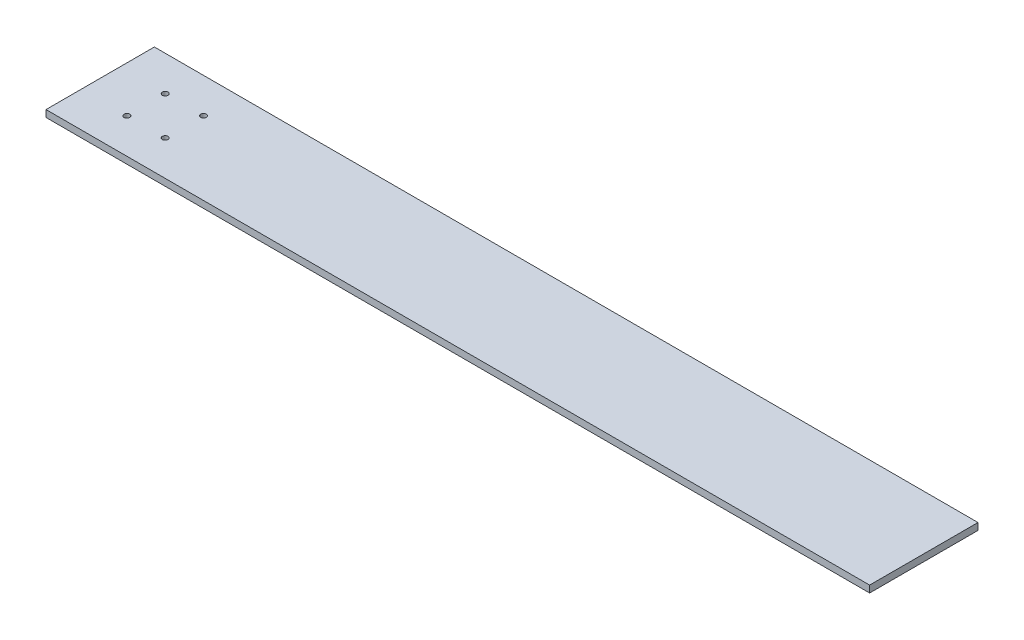
ISO-10303-21;
HEADER;
FILE_DESCRIPTION(('STEP AP214'),'2;1');
FILE_NAME('part.step','',(''),(''),'','','');
FILE_SCHEMA(('AUTOMOTIVE_DESIGN { 1 0 10303 214 1 1 1 1 }'));
ENDSEC;
DATA;
#1=APPLICATION_CONTEXT('core data for automotive mechanical design processes');
#2=APPLICATION_PROTOCOL_DEFINITION('international standard','automotive_design',2000,#1);
#3=PRODUCT_CONTEXT('',#1,'mechanical');
#4=PRODUCT('Part','Part','',(#3));
#5=PRODUCT_RELATED_PRODUCT_CATEGORY('part','',(#4));
#6=PRODUCT_DEFINITION_FORMATION('','',#4);
#7=PRODUCT_DEFINITION_CONTEXT('part definition',#1,'design');
#8=PRODUCT_DEFINITION('design','',#6,#7);
#9=PRODUCT_DEFINITION_SHAPE('','',#8);
#10=(LENGTH_UNIT() NAMED_UNIT(*) SI_UNIT(.MILLI.,.METRE.));
#11=(NAMED_UNIT(*) PLANE_ANGLE_UNIT() SI_UNIT($,.RADIAN.));
#12=(NAMED_UNIT(*) SI_UNIT($,.STERADIAN.) SOLID_ANGLE_UNIT());
#13=UNCERTAINTY_MEASURE_WITH_UNIT(LENGTH_MEASURE(1.E-05),#10,'distance_accuracy_value','');
#14=(GEOMETRIC_REPRESENTATION_CONTEXT(3) GLOBAL_UNCERTAINTY_ASSIGNED_CONTEXT((#13)) GLOBAL_UNIT_ASSIGNED_CONTEXT((#10,
#11,#12)) REPRESENTATION_CONTEXT('',''));
#15=CARTESIAN_POINT('',(0.,0.,0.));
#16=DIRECTION('',(0.,0.,1.));
#17=DIRECTION('',(1.,0.,0.));
#18=AXIS2_PLACEMENT_3D('',#15,#16,#17);
#19=CARTESIAN_POINT('',(0.,6.35,0.));
#20=DIRECTION('',(1.,0.,0.));
#21=DIRECTION('',(0.,0.,-1.));
#22=AXIS2_PLACEMENT_3D('',#19,#20,#21);
#23=PLANE('',#22);
#24=DIRECTION('',(0.,0.,1.));
#25=VECTOR('',#24,1.);
#26=CARTESIAN_POINT('',(0.,0.,0.));
#27=LINE('',#26,#25);
#28=CARTESIAN_POINT('',(0.,0.,-100.));
#29=VERTEX_POINT('',#28);
#30=CARTESIAN_POINT('',(0.,0.,0.));
#31=VERTEX_POINT('',#30);
#32=EDGE_CURVE('E122',#29,#31,#27,.T.);
#33=ORIENTED_EDGE('',*,*,#32,.T.);
#34=DIRECTION('',(0.,-1.,0.));
#35=VECTOR('',#34,1.);
#36=CARTESIAN_POINT('',(0.,6.35,0.));
#37=LINE('',#36,#35);
#38=CARTESIAN_POINT('',(0.,6.35,0.));
#39=VERTEX_POINT('',#38);
#40=EDGE_CURVE('E12',#39,#31,#37,.T.);
#41=ORIENTED_EDGE('',*,*,#40,.F.);
#42=DIRECTION('',(0.,0.,1.));
#43=VECTOR('',#42,1.);
#44=CARTESIAN_POINT('',(0.,6.35,0.));
#45=LINE('',#44,#43);
#46=CARTESIAN_POINT('',(0.,6.35,-100.));
#47=VERTEX_POINT('',#46);
#48=EDGE_CURVE('E89',#47,#39,#45,.T.);
#49=ORIENTED_EDGE('',*,*,#48,.F.);
#50=DIRECTION('',(0.,-1.,0.));
#51=VECTOR('',#50,1.);
#52=CARTESIAN_POINT('',(0.,6.35,-100.));
#53=LINE('',#52,#51);
#54=EDGE_CURVE('E100',#47,#29,#53,.T.);
#55=ORIENTED_EDGE('',*,*,#54,.T.);
#56=EDGE_LOOP('',(#33,#41,#49,#55));
#57=FACE_BOUND('',#56,.T.);
#58=ADVANCED_FACE('F38',(#57),#23,.F.);
#59=CARTESIAN_POINT('',(0.,6.35,0.));
#60=DIRECTION('',(0.,0.,-1.));
#61=DIRECTION('',(-1.,0.,0.));
#62=AXIS2_PLACEMENT_3D('',#59,#60,#61);
#63=PLANE('',#62);
#64=DIRECTION('',(1.,0.,0.));
#65=VECTOR('',#64,1.);
#66=CARTESIAN_POINT('',(0.,0.,0.));
#67=LINE('',#66,#65);
#68=CARTESIAN_POINT('',(760.,0.,0.));
#69=VERTEX_POINT('',#68);
#70=EDGE_CURVE('E94',#31,#69,#67,.T.);
#71=ORIENTED_EDGE('',*,*,#70,.T.);
#72=DIRECTION('',(0.,-1.,0.));
#73=VECTOR('',#72,1.);
#74=CARTESIAN_POINT('',(760.,6.35,0.));
#75=LINE('',#74,#73);
#76=CARTESIAN_POINT('',(760.,6.35,0.));
#77=VERTEX_POINT('',#76);
#78=EDGE_CURVE('E46',#77,#69,#75,.T.);
#79=ORIENTED_EDGE('',*,*,#78,.F.);
#80=DIRECTION('',(1.,0.,0.));
#81=VECTOR('',#80,1.);
#82=CARTESIAN_POINT('',(0.,6.35,0.));
#83=LINE('',#82,#81);
#84=EDGE_CURVE('E84',#39,#77,#83,.T.);
#85=ORIENTED_EDGE('',*,*,#84,.F.);
#86=ORIENTED_EDGE('',*,*,#40,.T.);
#87=EDGE_LOOP('',(#71,#79,#85,#86));
#88=FACE_BOUND('',#87,.T.);
#89=ADVANCED_FACE('F93',(#88),#63,.F.);
#90=CARTESIAN_POINT('',(760.,6.35,0.));
#91=DIRECTION('',(-1.,0.,0.));
#92=DIRECTION('',(0.,0.,1.));
#93=AXIS2_PLACEMENT_3D('',#90,#91,#92);
#94=PLANE('',#93);
#95=DIRECTION('',(0.,0.,-1.));
#96=VECTOR('',#95,1.);
#97=CARTESIAN_POINT('',(760.,0.,0.));
#98=LINE('',#97,#96);
#99=CARTESIAN_POINT('',(760.,0.,-100.));
#100=VERTEX_POINT('',#99);
#101=EDGE_CURVE('E71',#69,#100,#98,.T.);
#102=ORIENTED_EDGE('',*,*,#101,.T.);
#103=DIRECTION('',(0.,-1.,0.));
#104=VECTOR('',#103,1.);
#105=CARTESIAN_POINT('',(760.,6.35,-100.));
#106=LINE('',#105,#104);
#107=CARTESIAN_POINT('',(760.,6.35,-100.));
#108=VERTEX_POINT('',#107);
#109=EDGE_CURVE('E95',#108,#100,#106,.T.);
#110=ORIENTED_EDGE('',*,*,#109,.F.);
#111=DIRECTION('',(0.,0.,-1.));
#112=VECTOR('',#111,1.);
#113=CARTESIAN_POINT('',(760.,6.35,0.));
#114=LINE('',#113,#112);
#115=EDGE_CURVE('E87',#77,#108,#114,.T.);
#116=ORIENTED_EDGE('',*,*,#115,.F.);
#117=ORIENTED_EDGE('',*,*,#78,.T.);
#118=EDGE_LOOP('',(#102,#110,#116,#117));
#119=FACE_BOUND('',#118,.T.);
#120=ADVANCED_FACE('F96',(#119),#94,.F.);
#121=CARTESIAN_POINT('',(0.,6.35,-100.));
#122=DIRECTION('',(0.,0.,1.));
#123=DIRECTION('',(1.,0.,0.));
#124=AXIS2_PLACEMENT_3D('',#121,#122,#123);
#125=PLANE('',#124);
#126=DIRECTION('',(-1.,0.,0.));
#127=VECTOR('',#126,1.);
#128=CARTESIAN_POINT('',(0.,0.,-100.));
#129=LINE('',#128,#127);
#130=EDGE_CURVE('E77',#100,#29,#129,.T.);
#131=ORIENTED_EDGE('',*,*,#130,.T.);
#132=ORIENTED_EDGE('',*,*,#54,.F.);
#133=DIRECTION('',(-1.,0.,0.));
#134=VECTOR('',#133,1.);
#135=CARTESIAN_POINT('',(0.,6.35,-100.));
#136=LINE('',#135,#134);
#137=EDGE_CURVE('E54',#108,#47,#136,.T.);
#138=ORIENTED_EDGE('',*,*,#137,.F.);
#139=ORIENTED_EDGE('',*,*,#109,.T.);
#140=EDGE_LOOP('',(#131,#132,#138,#139));
#141=FACE_BOUND('',#140,.T.);
#142=ADVANCED_FACE('F161',(#141),#125,.F.);
#143=CARTESIAN_POINT('',(0.,6.35,0.));
#144=DIRECTION('',(0.,-1.,0.));
#145=DIRECTION('',(0.,0.,-1.));
#146=AXIS2_PLACEMENT_3D('',#143,#144,#145);
#147=PLANE('',#146);
#148=CARTESIAN_POINT('',(42.3225000000002,6.35,-32.3224999999998));
#149=DIRECTION('',(0.,1.,0.));
#150=DIRECTION('',(0.,0.,1.));
#151=AXIS2_PLACEMENT_3D('',#148,#149,#150);
#152=CIRCLE('',#151,2.625);
#153=CARTESIAN_POINT('',(42.3225000000002,6.35,-29.6974999999998));
#154=VERTEX_POINT('',#153);
#155=EDGE_CURVE('E123',#154,#154,#152,.T.);
#156=ORIENTED_EDGE('',*,*,#155,.F.);
#157=EDGE_LOOP('',(#156));
#158=FACE_BOUND('',#157,.T.);
#159=CARTESIAN_POINT('',(77.6775000000002,6.35,-32.3225000000002));
#160=DIRECTION('',(0.,1.,0.));
#161=DIRECTION('',(0.,0.,1.));
#162=AXIS2_PLACEMENT_3D('',#159,#160,#161);
#163=CIRCLE('',#162,2.625);
#164=CARTESIAN_POINT('',(77.6775000000002,6.35,-29.6975000000002));
#165=VERTEX_POINT('',#164);
#166=EDGE_CURVE('E133',#165,#165,#163,.T.);
#167=ORIENTED_EDGE('',*,*,#166,.F.);
#168=EDGE_LOOP('',(#167));
#169=FACE_BOUND('',#168,.T.);
#170=CARTESIAN_POINT('',(77.6774999999998,6.35,-67.6775000000003));
#171=DIRECTION('',(0.,1.,0.));
#172=DIRECTION('',(0.,0.,1.));
#173=AXIS2_PLACEMENT_3D('',#170,#171,#172);
#174=CIRCLE('',#173,2.625);
#175=CARTESIAN_POINT('',(77.6774999999998,6.35,-65.0525000000003));
#176=VERTEX_POINT('',#175);
#177=EDGE_CURVE('E140',#176,#176,#174,.T.);
#178=ORIENTED_EDGE('',*,*,#177,.F.);
#179=EDGE_LOOP('',(#178));
#180=FACE_BOUND('',#179,.T.);
#181=CARTESIAN_POINT('',(42.3224999999998,6.35,-67.6774999999998));
#182=DIRECTION('',(0.,1.,0.));
#183=DIRECTION('',(0.,0.,1.));
#184=AXIS2_PLACEMENT_3D('',#181,#182,#183);
#185=CIRCLE('',#184,2.625);
#186=CARTESIAN_POINT('',(42.3224999999998,6.35,-65.0524999999998));
#187=VERTEX_POINT('',#186);
#188=EDGE_CURVE('E113',#187,#187,#185,.T.);
#189=ORIENTED_EDGE('',*,*,#188,.F.);
#190=EDGE_LOOP('',(#189));
#191=FACE_BOUND('',#190,.T.);
#192=ORIENTED_EDGE('',*,*,#48,.T.);
#193=ORIENTED_EDGE('',*,*,#84,.T.);
#194=ORIENTED_EDGE('',*,*,#115,.T.);
#195=ORIENTED_EDGE('',*,*,#137,.T.);
#196=EDGE_LOOP('',(#192,#193,#194,#195));
#197=FACE_BOUND('',#196,.T.);
#198=ADVANCED_FACE('F85',(#158,#169,#180,#191,#197),#147,.F.);
#199=CARTESIAN_POINT('',(0.,0.,0.));
#200=DIRECTION('',(0.,-1.,0.));
#201=DIRECTION('',(0.,0.,-1.));
#202=AXIS2_PLACEMENT_3D('',#199,#200,#201);
#203=PLANE('',#202);
#204=CARTESIAN_POINT('',(42.3225000000002,0.,-32.3224999999998));
#205=DIRECTION('',(0.,1.,0.));
#206=DIRECTION('',(0.,0.,1.));
#207=AXIS2_PLACEMENT_3D('',#204,#205,#206);
#208=CIRCLE('',#207,2.625);
#209=CARTESIAN_POINT('',(42.3225000000002,0.,-29.6974999999998));
#210=VERTEX_POINT('',#209);
#211=EDGE_CURVE('E128',#210,#210,#208,.T.);
#212=ORIENTED_EDGE('',*,*,#211,.T.);
#213=EDGE_LOOP('',(#212));
#214=FACE_BOUND('',#213,.T.);
#215=CARTESIAN_POINT('',(77.6775000000002,0.,-32.3225000000002));
#216=DIRECTION('',(0.,1.,0.));
#217=DIRECTION('',(0.,0.,1.));
#218=AXIS2_PLACEMENT_3D('',#215,#216,#217);
#219=CIRCLE('',#218,2.625);
#220=CARTESIAN_POINT('',(77.6775000000002,0.,-29.6975000000002));
#221=VERTEX_POINT('',#220);
#222=EDGE_CURVE('E138',#221,#221,#219,.T.);
#223=ORIENTED_EDGE('',*,*,#222,.T.);
#224=EDGE_LOOP('',(#223));
#225=FACE_BOUND('',#224,.T.);
#226=CARTESIAN_POINT('',(77.6774999999998,0.,-67.6775000000003));
#227=DIRECTION('',(0.,1.,0.));
#228=DIRECTION('',(0.,0.,1.));
#229=AXIS2_PLACEMENT_3D('',#226,#227,#228);
#230=CIRCLE('',#229,2.625);
#231=CARTESIAN_POINT('',(77.6774999999998,0.,-65.0525000000003));
#232=VERTEX_POINT('',#231);
#233=EDGE_CURVE('E119',#232,#232,#230,.T.);
#234=ORIENTED_EDGE('',*,*,#233,.T.);
#235=EDGE_LOOP('',(#234));
#236=FACE_BOUND('',#235,.T.);
#237=CARTESIAN_POINT('',(42.3224999999998,0.,-67.6774999999998));
#238=DIRECTION('',(0.,1.,0.));
#239=DIRECTION('',(0.,0.,1.));
#240=AXIS2_PLACEMENT_3D('',#237,#238,#239);
#241=CIRCLE('',#240,2.625);
#242=CARTESIAN_POINT('',(42.3224999999998,0.,-65.0524999999998));
#243=VERTEX_POINT('',#242);
#244=EDGE_CURVE('E118',#243,#243,#241,.T.);
#245=ORIENTED_EDGE('',*,*,#244,.T.);
#246=EDGE_LOOP('',(#245));
#247=FACE_BOUND('',#246,.T.);
#248=ORIENTED_EDGE('',*,*,#32,.F.);
#249=ORIENTED_EDGE('',*,*,#130,.F.);
#250=ORIENTED_EDGE('',*,*,#101,.F.);
#251=ORIENTED_EDGE('',*,*,#70,.F.);
#252=EDGE_LOOP('',(#248,#249,#250,#251));
#253=FACE_BOUND('',#252,.T.);
#254=ADVANCED_FACE('F148',(#214,#225,#236,#247,#253),#203,.T.);
#255=CARTESIAN_POINT('',(42.3224999999998,0.,-67.6774999999998));
#256=DIRECTION('',(0.,1.,0.));
#257=DIRECTION('',(0.,0.,1.));
#258=AXIS2_PLACEMENT_3D('',#255,#256,#257);
#259=CYLINDRICAL_SURFACE('',#258,2.625);
#260=ORIENTED_EDGE('',*,*,#244,.F.);
#261=EDGE_LOOP('',(#260));
#262=FACE_BOUND('',#261,.T.);
#263=ORIENTED_EDGE('',*,*,#188,.T.);
#264=EDGE_LOOP('',(#263));
#265=FACE_BOUND('',#264,.T.);
#266=ADVANCED_FACE('F155',(#262,#265),#259,.F.);
#267=CARTESIAN_POINT('',(77.6774999999998,0.,-67.6775000000003));
#268=DIRECTION('',(0.,1.,0.));
#269=DIRECTION('',(0.,0.,1.));
#270=AXIS2_PLACEMENT_3D('',#267,#268,#269);
#271=CYLINDRICAL_SURFACE('',#270,2.625);
#272=ORIENTED_EDGE('',*,*,#233,.F.);
#273=EDGE_LOOP('',(#272));
#274=FACE_BOUND('',#273,.T.);
#275=ORIENTED_EDGE('',*,*,#177,.T.);
#276=EDGE_LOOP('',(#275));
#277=FACE_BOUND('',#276,.T.);
#278=ADVANCED_FACE('F151',(#274,#277),#271,.F.);
#279=CARTESIAN_POINT('',(77.6775000000002,0.,-32.3225000000002));
#280=DIRECTION('',(0.,1.,0.));
#281=DIRECTION('',(0.,0.,1.));
#282=AXIS2_PLACEMENT_3D('',#279,#280,#281);
#283=CYLINDRICAL_SURFACE('',#282,2.625);
#284=ORIENTED_EDGE('',*,*,#222,.F.);
#285=EDGE_LOOP('',(#284));
#286=FACE_BOUND('',#285,.T.);
#287=ORIENTED_EDGE('',*,*,#166,.T.);
#288=EDGE_LOOP('',(#287));
#289=FACE_BOUND('',#288,.T.);
#290=ADVANCED_FACE('F154',(#286,#289),#283,.F.);
#291=CARTESIAN_POINT('',(42.3225000000002,0.,-32.3224999999998));
#292=DIRECTION('',(0.,1.,0.));
#293=DIRECTION('',(0.,0.,1.));
#294=AXIS2_PLACEMENT_3D('',#291,#292,#293);
#295=CYLINDRICAL_SURFACE('',#294,2.625);
#296=ORIENTED_EDGE('',*,*,#211,.F.);
#297=EDGE_LOOP('',(#296));
#298=FACE_BOUND('',#297,.T.);
#299=ORIENTED_EDGE('',*,*,#155,.T.);
#300=EDGE_LOOP('',(#299));
#301=FACE_BOUND('',#300,.T.);
#302=ADVANCED_FACE('F240',(#298,#301),#295,.F.);
#303=CLOSED_SHELL('',(#58,#89,#120,#142,#198,#254,#266,#278,#290,#302));
#304=MANIFOLD_SOLID_BREP('B2',#303);
#305=ADVANCED_BREP_SHAPE_REPRESENTATION('',(#18,#304),#14);
#306=SHAPE_DEFINITION_REPRESENTATION(#9,#305);
ENDSEC;
END-ISO-10303-21;
